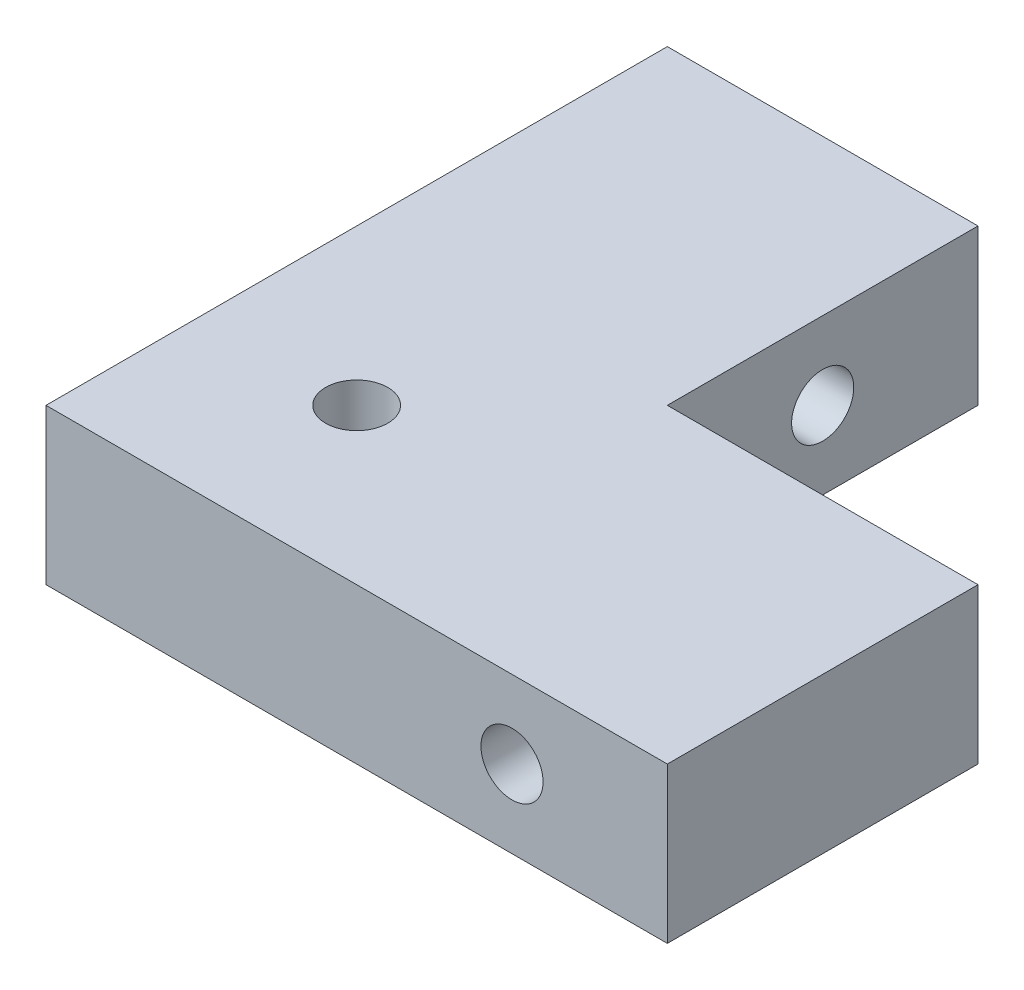
ISO-10303-21;
HEADER;
FILE_DESCRIPTION(('STEP AP214'),'2;1');
FILE_NAME('part.step','',(''),(''),'','','');
FILE_SCHEMA(('AUTOMOTIVE_DESIGN { 1 0 10303 214 1 1 1 1 }'));
ENDSEC;
DATA;
#1=APPLICATION_CONTEXT('core data for automotive mechanical design processes');
#2=APPLICATION_PROTOCOL_DEFINITION('international standard','automotive_design',2000,#1);
#3=PRODUCT_CONTEXT('',#1,'mechanical');
#4=PRODUCT('Part','Part','',(#3));
#5=PRODUCT_RELATED_PRODUCT_CATEGORY('part','',(#4));
#6=PRODUCT_DEFINITION_FORMATION('','',#4);
#7=PRODUCT_DEFINITION_CONTEXT('part definition',#1,'design');
#8=PRODUCT_DEFINITION('design','',#6,#7);
#9=PRODUCT_DEFINITION_SHAPE('','',#8);
#10=(LENGTH_UNIT() NAMED_UNIT(*) SI_UNIT(.MILLI.,.METRE.));
#11=(NAMED_UNIT(*) PLANE_ANGLE_UNIT() SI_UNIT($,.RADIAN.));
#12=(NAMED_UNIT(*) SI_UNIT($,.STERADIAN.) SOLID_ANGLE_UNIT());
#13=UNCERTAINTY_MEASURE_WITH_UNIT(LENGTH_MEASURE(1.E-05),#10,'distance_accuracy_value','');
#14=(GEOMETRIC_REPRESENTATION_CONTEXT(3) GLOBAL_UNCERTAINTY_ASSIGNED_CONTEXT((#13)) GLOBAL_UNIT_ASSIGNED_CONTEXT((#10,
#11,#12)) REPRESENTATION_CONTEXT('',''));
#15=CARTESIAN_POINT('',(0.,0.,0.));
#16=DIRECTION('',(0.,0.,1.));
#17=DIRECTION('',(1.,0.,0.));
#18=AXIS2_PLACEMENT_3D('',#15,#16,#17);
#19=CARTESIAN_POINT('',(-30.,20.,-36.304347826087));
#20=DIRECTION('',(0.,0.,1.));
#21=DIRECTION('',(1.,0.,0.));
#22=AXIS2_PLACEMENT_3D('',#19,#20,#21);
#23=PLANE('',#22);
#24=DIRECTION('',(-1.,0.,0.));
#25=VECTOR('',#24,1.);
#26=CARTESIAN_POINT('',(-30.,0.,-36.304347826087));
#27=LINE('',#26,#25);
#28=CARTESIAN_POINT('',(-30.,0.,-36.304347826087));
#29=VERTEX_POINT('',#28);
#30=CARTESIAN_POINT('',(-70.,0.,-36.3043478260869));
#31=VERTEX_POINT('',#30);
#32=EDGE_CURVE('E117',#29,#31,#27,.T.);
#33=ORIENTED_EDGE('',*,*,#32,.T.);
#34=DIRECTION('',(0.,-1.,0.));
#35=VECTOR('',#34,1.);
#36=CARTESIAN_POINT('',(-70.,20.,-36.3043478260869));
#37=LINE('',#36,#35);
#38=CARTESIAN_POINT('',(-70.,20.,-36.3043478260869));
#39=VERTEX_POINT('',#38);
#40=EDGE_CURVE('E11',#39,#31,#37,.T.);
#41=ORIENTED_EDGE('',*,*,#40,.F.);
#42=DIRECTION('',(-1.,0.,0.));
#43=VECTOR('',#42,1.);
#44=CARTESIAN_POINT('',(-30.,20.,-36.304347826087));
#45=LINE('',#44,#43);
#46=CARTESIAN_POINT('',(-30.,20.,-36.304347826087));
#47=VERTEX_POINT('',#46);
#48=EDGE_CURVE('E128',#47,#39,#45,.T.);
#49=ORIENTED_EDGE('',*,*,#48,.F.);
#50=DIRECTION('',(0.,-1.,0.));
#51=VECTOR('',#50,1.);
#52=CARTESIAN_POINT('',(-30.,20.,-36.304347826087));
#53=LINE('',#52,#51);
#54=EDGE_CURVE('E113',#47,#29,#53,.T.);
#55=ORIENTED_EDGE('',*,*,#54,.T.);
#56=EDGE_LOOP('',(#33,#41,#49,#55));
#57=FACE_BOUND('',#56,.T.);
#58=ADVANCED_FACE('F33',(#57),#23,.F.);
#59=CARTESIAN_POINT('',(-70.,20.,-36.3043478260869));
#60=DIRECTION('',(1.,0.,0.));
#61=DIRECTION('',(0.,0.,-1.));
#62=AXIS2_PLACEMENT_3D('',#59,#60,#61);
#63=PLANE('',#62);
#64=CARTESIAN_POINT('',(-70.,10.,-16.304347826087));
#65=DIRECTION('',(1.,0.,0.));
#66=DIRECTION('',(0.,0.,-1.));
#67=AXIS2_PLACEMENT_3D('',#64,#65,#66);
#68=CIRCLE('',#67,4.);
#69=CARTESIAN_POINT('',(-70.,10.,-20.304347826087));
#70=VERTEX_POINT('',#69);
#71=EDGE_CURVE('E121',#70,#70,#68,.T.);
#72=ORIENTED_EDGE('',*,*,#71,.T.);
#73=EDGE_LOOP('',(#72));
#74=FACE_BOUND('',#73,.T.);
#75=DIRECTION('',(0.,0.,1.));
#76=VECTOR('',#75,1.);
#77=CARTESIAN_POINT('',(-70.,0.,-36.3043478260869));
#78=LINE('',#77,#76);
#79=CARTESIAN_POINT('',(-70.,0.,43.695652173913));
#80=VERTEX_POINT('',#79);
#81=EDGE_CURVE('E120',#31,#80,#78,.T.);
#82=ORIENTED_EDGE('',*,*,#81,.T.);
#83=DIRECTION('',(0.,-1.,0.));
#84=VECTOR('',#83,1.);
#85=CARTESIAN_POINT('',(-70.,20.,43.695652173913));
#86=LINE('',#85,#84);
#87=CARTESIAN_POINT('',(-70.,20.,43.695652173913));
#88=VERTEX_POINT('',#87);
#89=EDGE_CURVE('E41',#88,#80,#86,.T.);
#90=ORIENTED_EDGE('',*,*,#89,.F.);
#91=DIRECTION('',(0.,0.,1.));
#92=VECTOR('',#91,1.);
#93=CARTESIAN_POINT('',(-70.,20.,-36.3043478260869));
#94=LINE('',#93,#92);
#95=EDGE_CURVE('E86',#39,#88,#94,.T.);
#96=ORIENTED_EDGE('',*,*,#95,.F.);
#97=ORIENTED_EDGE('',*,*,#40,.T.);
#98=EDGE_LOOP('',(#82,#90,#96,#97));
#99=FACE_BOUND('',#98,.T.);
#100=ADVANCED_FACE('F157',(#74,#99),#63,.F.);
#101=CARTESIAN_POINT('',(-70.,20.,43.695652173913));
#102=DIRECTION('',(0.,0.,-1.));
#103=DIRECTION('',(-1.,0.,0.));
#104=AXIS2_PLACEMENT_3D('',#101,#102,#103);
#105=PLANE('',#104);
#106=CARTESIAN_POINT('',(-10.,10.,43.695652173913));
#107=DIRECTION('',(0.,0.,-1.));
#108=DIRECTION('',(-1.,0.,0.));
#109=AXIS2_PLACEMENT_3D('',#106,#107,#108);
#110=CIRCLE('',#109,4.);
#111=CARTESIAN_POINT('',(-14.,10.,43.695652173913));
#112=VERTEX_POINT('',#111);
#113=EDGE_CURVE('E227',#112,#112,#110,.T.);
#114=ORIENTED_EDGE('',*,*,#113,.T.);
#115=EDGE_LOOP('',(#114));
#116=FACE_BOUND('',#115,.T.);
#117=DIRECTION('',(1.,0.,0.));
#118=VECTOR('',#117,1.);
#119=CARTESIAN_POINT('',(-70.,0.,43.695652173913));
#120=LINE('',#119,#118);
#121=CARTESIAN_POINT('',(10.,0.,43.695652173913));
#122=VERTEX_POINT('',#121);
#123=EDGE_CURVE('E123',#80,#122,#120,.T.);
#124=ORIENTED_EDGE('',*,*,#123,.T.);
#125=DIRECTION('',(0.,-1.,0.));
#126=VECTOR('',#125,1.);
#127=CARTESIAN_POINT('',(10.,20.,43.695652173913));
#128=LINE('',#127,#126);
#129=CARTESIAN_POINT('',(10.,20.,43.695652173913));
#130=VERTEX_POINT('',#129);
#131=EDGE_CURVE('E108',#130,#122,#128,.T.);
#132=ORIENTED_EDGE('',*,*,#131,.F.);
#133=DIRECTION('',(1.,0.,0.));
#134=VECTOR('',#133,1.);
#135=CARTESIAN_POINT('',(-70.,20.,43.695652173913));
#136=LINE('',#135,#134);
#137=EDGE_CURVE('E99',#88,#130,#136,.T.);
#138=ORIENTED_EDGE('',*,*,#137,.F.);
#139=ORIENTED_EDGE('',*,*,#89,.T.);
#140=EDGE_LOOP('',(#124,#132,#138,#139));
#141=FACE_BOUND('',#140,.T.);
#142=ADVANCED_FACE('F134',(#116,#141),#105,.F.);
#143=CARTESIAN_POINT('',(10.,20.,43.695652173913));
#144=DIRECTION('',(-1.,0.,0.));
#145=DIRECTION('',(0.,0.,1.));
#146=AXIS2_PLACEMENT_3D('',#143,#144,#145);
#147=PLANE('',#146);
#148=DIRECTION('',(0.,0.,-1.));
#149=VECTOR('',#148,1.);
#150=CARTESIAN_POINT('',(10.,0.,43.695652173913));
#151=LINE('',#150,#149);
#152=CARTESIAN_POINT('',(10.,0.,3.69565217391304));
#153=VERTEX_POINT('',#152);
#154=EDGE_CURVE('E107',#122,#153,#151,.T.);
#155=ORIENTED_EDGE('',*,*,#154,.T.);
#156=DIRECTION('',(0.,-1.,0.));
#157=VECTOR('',#156,1.);
#158=CARTESIAN_POINT('',(10.,20.,3.69565217391304));
#159=LINE('',#158,#157);
#160=CARTESIAN_POINT('',(10.,20.,3.69565217391304));
#161=VERTEX_POINT('',#160);
#162=EDGE_CURVE('E104',#161,#153,#159,.T.);
#163=ORIENTED_EDGE('',*,*,#162,.F.);
#164=DIRECTION('',(0.,0.,-1.));
#165=VECTOR('',#164,1.);
#166=CARTESIAN_POINT('',(10.,20.,43.695652173913));
#167=LINE('',#166,#165);
#168=EDGE_CURVE('E93',#130,#161,#167,.T.);
#169=ORIENTED_EDGE('',*,*,#168,.F.);
#170=ORIENTED_EDGE('',*,*,#131,.T.);
#171=EDGE_LOOP('',(#155,#163,#169,#170));
#172=FACE_BOUND('',#171,.T.);
#173=ADVANCED_FACE('F105',(#172),#147,.F.);
#174=CARTESIAN_POINT('',(10.,20.,3.69565217391304));
#175=DIRECTION('',(0.,0.,1.));
#176=DIRECTION('',(1.,0.,0.));
#177=AXIS2_PLACEMENT_3D('',#174,#175,#176);
#178=PLANE('',#177);
#179=CARTESIAN_POINT('',(-10.,10.,3.69565217391304));
#180=DIRECTION('',(0.,0.,-1.));
#181=DIRECTION('',(-1.,0.,0.));
#182=AXIS2_PLACEMENT_3D('',#179,#180,#181);
#183=CIRCLE('',#182,4.);
#184=CARTESIAN_POINT('',(-14.,10.,3.69565217391304));
#185=VERTEX_POINT('',#184);
#186=EDGE_CURVE('E231',#185,#185,#183,.T.);
#187=ORIENTED_EDGE('',*,*,#186,.F.);
#188=EDGE_LOOP('',(#187));
#189=FACE_BOUND('',#188,.T.);
#190=DIRECTION('',(-1.,0.,0.));
#191=VECTOR('',#190,1.);
#192=CARTESIAN_POINT('',(10.,0.,3.69565217391304));
#193=LINE('',#192,#191);
#194=CARTESIAN_POINT('',(-30.,0.,3.69565217391305));
#195=VERTEX_POINT('',#194);
#196=EDGE_CURVE('E72',#153,#195,#193,.T.);
#197=ORIENTED_EDGE('',*,*,#196,.T.);
#198=DIRECTION('',(0.,-1.,0.));
#199=VECTOR('',#198,1.);
#200=CARTESIAN_POINT('',(-30.,20.,3.69565217391305));
#201=LINE('',#200,#199);
#202=CARTESIAN_POINT('',(-30.,20.,3.69565217391305));
#203=VERTEX_POINT('',#202);
#204=EDGE_CURVE('E109',#203,#195,#201,.T.);
#205=ORIENTED_EDGE('',*,*,#204,.F.);
#206=DIRECTION('',(-1.,0.,0.));
#207=VECTOR('',#206,1.);
#208=CARTESIAN_POINT('',(10.,20.,3.69565217391304));
#209=LINE('',#208,#207);
#210=EDGE_CURVE('E97',#161,#203,#209,.T.);
#211=ORIENTED_EDGE('',*,*,#210,.F.);
#212=ORIENTED_EDGE('',*,*,#162,.T.);
#213=EDGE_LOOP('',(#197,#205,#211,#212));
#214=FACE_BOUND('',#213,.T.);
#215=ADVANCED_FACE('F111',(#189,#214),#178,.F.);
#216=CARTESIAN_POINT('',(-30.,20.,3.69565217391305));
#217=DIRECTION('',(-1.,0.,0.));
#218=DIRECTION('',(0.,0.,1.));
#219=AXIS2_PLACEMENT_3D('',#216,#217,#218);
#220=PLANE('',#219);
#221=CARTESIAN_POINT('',(-30.,10.,-16.304347826087));
#222=DIRECTION('',(1.,0.,0.));
#223=DIRECTION('',(0.,0.,-1.));
#224=AXIS2_PLACEMENT_3D('',#221,#222,#223);
#225=CIRCLE('',#224,4.);
#226=CARTESIAN_POINT('',(-30.,10.,-20.304347826087));
#227=VERTEX_POINT('',#226);
#228=EDGE_CURVE('E226',#227,#227,#225,.T.);
#229=ORIENTED_EDGE('',*,*,#228,.F.);
#230=EDGE_LOOP('',(#229));
#231=FACE_BOUND('',#230,.T.);
#232=DIRECTION('',(0.,0.,-1.));
#233=VECTOR('',#232,1.);
#234=CARTESIAN_POINT('',(-30.,0.,3.69565217391305));
#235=LINE('',#234,#233);
#236=EDGE_CURVE('E78',#195,#29,#235,.T.);
#237=ORIENTED_EDGE('',*,*,#236,.T.);
#238=ORIENTED_EDGE('',*,*,#54,.F.);
#239=DIRECTION('',(0.,0.,-1.));
#240=VECTOR('',#239,1.);
#241=CARTESIAN_POINT('',(-30.,20.,3.69565217391305));
#242=LINE('',#241,#240);
#243=EDGE_CURVE('E49',#203,#47,#242,.T.);
#244=ORIENTED_EDGE('',*,*,#243,.F.);
#245=ORIENTED_EDGE('',*,*,#204,.T.);
#246=EDGE_LOOP('',(#237,#238,#244,#245));
#247=FACE_BOUND('',#246,.T.);
#248=ADVANCED_FACE('F141',(#231,#247),#220,.F.);
#249=CARTESIAN_POINT('',(0.,20.,0.));
#250=DIRECTION('',(0.,1.,0.));
#251=DIRECTION('',(0.,0.,1.));
#252=AXIS2_PLACEMENT_3D('',#249,#250,#251);
#253=PLANE('',#252);
#254=CARTESIAN_POINT('',(-50.,20.,23.695652173913));
#255=DIRECTION('',(0.,-1.,0.));
#256=DIRECTION('',(0.,0.,-1.));
#257=AXIS2_PLACEMENT_3D('',#254,#255,#256);
#258=CIRCLE('',#257,4.00000000000001);
#259=CARTESIAN_POINT('',(-50.,20.,19.695652173913));
#260=VERTEX_POINT('',#259);
#261=EDGE_CURVE('E237',#260,#260,#258,.T.);
#262=ORIENTED_EDGE('',*,*,#261,.T.);
#263=EDGE_LOOP('',(#262));
#264=FACE_BOUND('',#263,.T.);
#265=ORIENTED_EDGE('',*,*,#48,.T.);
#266=ORIENTED_EDGE('',*,*,#95,.T.);
#267=ORIENTED_EDGE('',*,*,#137,.T.);
#268=ORIENTED_EDGE('',*,*,#168,.T.);
#269=ORIENTED_EDGE('',*,*,#210,.T.);
#270=ORIENTED_EDGE('',*,*,#243,.T.);
#271=EDGE_LOOP('',(#265,#266,#267,#268,#269,#270));
#272=FACE_BOUND('',#271,.T.);
#273=ADVANCED_FACE('F95',(#264,#272),#253,.T.);
#274=CARTESIAN_POINT('',(0.,0.,0.));
#275=DIRECTION('',(0.,1.,0.));
#276=DIRECTION('',(0.,0.,1.));
#277=AXIS2_PLACEMENT_3D('',#274,#275,#276);
#278=PLANE('',#277);
#279=CARTESIAN_POINT('',(-50.,0.,23.695652173913));
#280=DIRECTION('',(0.,-1.,0.));
#281=DIRECTION('',(0.,0.,-1.));
#282=AXIS2_PLACEMENT_3D('',#279,#280,#281);
#283=CIRCLE('',#282,4.00000000000001);
#284=CARTESIAN_POINT('',(-50.,0.,19.695652173913));
#285=VERTEX_POINT('',#284);
#286=EDGE_CURVE('E239',#285,#285,#283,.T.);
#287=ORIENTED_EDGE('',*,*,#286,.F.);
#288=EDGE_LOOP('',(#287));
#289=FACE_BOUND('',#288,.T.);
#290=ORIENTED_EDGE('',*,*,#32,.F.);
#291=ORIENTED_EDGE('',*,*,#236,.F.);
#292=ORIENTED_EDGE('',*,*,#196,.F.);
#293=ORIENTED_EDGE('',*,*,#154,.F.);
#294=ORIENTED_EDGE('',*,*,#123,.F.);
#295=ORIENTED_EDGE('',*,*,#81,.F.);
#296=EDGE_LOOP('',(#290,#291,#292,#293,#294,#295));
#297=FACE_BOUND('',#296,.T.);
#298=ADVANCED_FACE('F137',(#289,#297),#278,.F.);
#299=CARTESIAN_POINT('',(-70.,10.,-16.304347826087));
#300=DIRECTION('',(1.,0.,0.));
#301=DIRECTION('',(0.,0.,-1.));
#302=AXIS2_PLACEMENT_3D('',#299,#300,#301);
#303=CYLINDRICAL_SURFACE('',#302,4.);
#304=ORIENTED_EDGE('',*,*,#71,.F.);
#305=EDGE_LOOP('',(#304));
#306=FACE_BOUND('',#305,.T.);
#307=ORIENTED_EDGE('',*,*,#228,.T.);
#308=EDGE_LOOP('',(#307));
#309=FACE_BOUND('',#308,.T.);
#310=ADVANCED_FACE('F192',(#306,#309),#303,.F.);
#311=CARTESIAN_POINT('',(-10.,10.,43.695652173913));
#312=DIRECTION('',(0.,0.,-1.));
#313=DIRECTION('',(-1.,0.,0.));
#314=AXIS2_PLACEMENT_3D('',#311,#312,#313);
#315=CYLINDRICAL_SURFACE('',#314,4.);
#316=ORIENTED_EDGE('',*,*,#113,.F.);
#317=EDGE_LOOP('',(#316));
#318=FACE_BOUND('',#317,.T.);
#319=ORIENTED_EDGE('',*,*,#186,.T.);
#320=EDGE_LOOP('',(#319));
#321=FACE_BOUND('',#320,.T.);
#322=ADVANCED_FACE('F187',(#318,#321),#315,.F.);
#323=CARTESIAN_POINT('',(-50.,20.,23.695652173913));
#324=DIRECTION('',(0.,-1.,0.));
#325=DIRECTION('',(0.,0.,-1.));
#326=AXIS2_PLACEMENT_3D('',#323,#324,#325);
#327=CYLINDRICAL_SURFACE('',#326,4.00000000000001);
#328=ORIENTED_EDGE('',*,*,#261,.F.);
#329=EDGE_LOOP('',(#328));
#330=FACE_BOUND('',#329,.T.);
#331=ORIENTED_EDGE('',*,*,#286,.T.);
#332=EDGE_LOOP('',(#331));
#333=FACE_BOUND('',#332,.T.);
#334=ADVANCED_FACE('F191',(#330,#333),#327,.F.);
#335=CLOSED_SHELL('',(#58,#100,#142,#173,#215,#248,#273,#298,#310,#322,#334));
#336=MANIFOLD_SOLID_BREP('B2',#335);
#337=ADVANCED_BREP_SHAPE_REPRESENTATION('',(#18,#336),#14);
#338=SHAPE_DEFINITION_REPRESENTATION(#9,#337);
ENDSEC;
END-ISO-10303-21;
